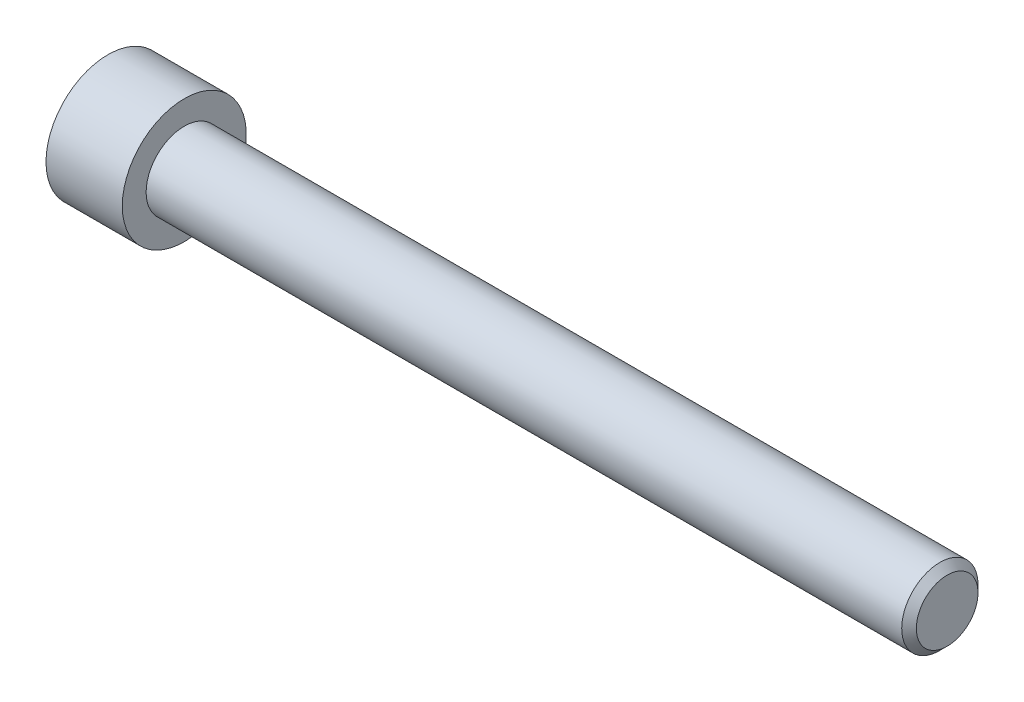
ISO-10303-21;
HEADER;
FILE_DESCRIPTION(('STEP AP214'),'2;1');
FILE_NAME('part.step','',(''),(''),'','','');
FILE_SCHEMA(('AUTOMOTIVE_DESIGN { 1 0 10303 214 1 1 1 1 }'));
ENDSEC;
DATA;
#1=APPLICATION_CONTEXT('core data for automotive mechanical design processes');
#2=APPLICATION_PROTOCOL_DEFINITION('international standard','automotive_design',2000,#1);
#3=PRODUCT_CONTEXT('',#1,'mechanical');
#4=PRODUCT('Part','Part','',(#3));
#5=PRODUCT_RELATED_PRODUCT_CATEGORY('part','',(#4));
#6=PRODUCT_DEFINITION_FORMATION('','',#4);
#7=PRODUCT_DEFINITION_CONTEXT('part definition',#1,'design');
#8=PRODUCT_DEFINITION('design','',#6,#7);
#9=PRODUCT_DEFINITION_SHAPE('','',#8);
#10=(LENGTH_UNIT() NAMED_UNIT(*) SI_UNIT(.MILLI.,.METRE.));
#11=(NAMED_UNIT(*) PLANE_ANGLE_UNIT() SI_UNIT($,.RADIAN.));
#12=(NAMED_UNIT(*) SI_UNIT($,.STERADIAN.) SOLID_ANGLE_UNIT());
#13=UNCERTAINTY_MEASURE_WITH_UNIT(LENGTH_MEASURE(1.E-05),#10,'distance_accuracy_value','');
#14=(GEOMETRIC_REPRESENTATION_CONTEXT(3) GLOBAL_UNCERTAINTY_ASSIGNED_CONTEXT((#13)) GLOBAL_UNIT_ASSIGNED_CONTEXT((#10,
#11,#12)) REPRESENTATION_CONTEXT('',''));
#15=CARTESIAN_POINT('',(0.,0.,0.));
#16=DIRECTION('',(0.,0.,1.));
#17=DIRECTION('',(1.,0.,0.));
#18=AXIS2_PLACEMENT_3D('',#15,#16,#17);
#19=CARTESIAN_POINT('',(-4.0000000000191,0.,0.));
#20=DIRECTION('',(-1.,0.,0.));
#21=DIRECTION('',(0.,0.,1.));
#22=AXIS2_PLACEMENT_3D('',#19,#20,#21);
#23=CONICAL_SURFACE('',#22,2.99000000001115,1.04719755118497);
#24=CARTESIAN_POINT('',(-4.0000000000191,0.,0.));
#25=DIRECTION('',(-1.,0.,0.));
#26=DIRECTION('',(0.,0.,1.));
#27=AXIS2_PLACEMENT_3D('',#24,#25,#26);
#28=CIRCLE('',#27,2.99000000001115);
#29=CARTESIAN_POINT('',(-4.0000000000191,0.,2.99000000001115));
#30=VERTEX_POINT('',#29);
#31=EDGE_CURVE('E19',#30,#30,#28,.T.);
#32=ORIENTED_EDGE('',*,*,#31,.T.);
#33=EDGE_LOOP('',(#32));
#34=FACE_BOUND('',#33,.T.);
#35=CARTESIAN_POINT('',(-2.27372269515058,-5.6843418860808E-11,0.));
#36=VERTEX_POINT('',#35);
#37=VERTEX_LOOP('',#36);
#38=FACE_BOUND('',#37,.T.);
#39=ADVANCED_FACE('F16',(#34,#38),#23,.F.);
#40=CARTESIAN_POINT('',(-4.,0.,0.));
#41=DIRECTION('',(1.,0.,0.));
#42=DIRECTION('',(0.,0.,-1.));
#43=AXIS2_PLACEMENT_3D('',#40,#41,#42);
#44=PLANE('',#43);
#45=ORIENTED_EDGE('',*,*,#31,.F.);
#46=EDGE_LOOP('',(#45));
#47=FACE_BOUND('',#46,.T.);
#48=DIRECTION('',(0.,0.5,0.866025403784439));
#49=VECTOR('',#48,1.);
#50=CARTESIAN_POINT('',(-4.,3.46410161513775,0.));
#51=LINE('',#50,#49);
#52=CARTESIAN_POINT('',(-4.,3.46410161513775,0.));
#53=VERTEX_POINT('',#52);
#54=CARTESIAN_POINT('',(-4.,1.73205080756888,-3.));
#55=VERTEX_POINT('',#54);
#56=EDGE_CURVE('E157',#53,#55,#51,.F.);
#57=ORIENTED_EDGE('',*,*,#56,.T.);
#58=DIRECTION('',(0.,1.,0.));
#59=VECTOR('',#58,1.);
#60=CARTESIAN_POINT('',(-4.,1.73205080756888,-3.));
#61=LINE('',#60,#59);
#62=CARTESIAN_POINT('',(-4.,-1.73205080756888,-3.));
#63=VERTEX_POINT('',#62);
#64=EDGE_CURVE('E170',#55,#63,#61,.F.);
#65=ORIENTED_EDGE('',*,*,#64,.T.);
#66=DIRECTION('',(0.,0.5,-0.866025403784439));
#67=VECTOR('',#66,1.);
#68=CARTESIAN_POINT('',(-4.,-1.73205080756888,-3.));
#69=LINE('',#68,#67);
#70=CARTESIAN_POINT('',(-4.,-3.46410161513775,0.));
#71=VERTEX_POINT('',#70);
#72=EDGE_CURVE('E177',#63,#71,#69,.F.);
#73=ORIENTED_EDGE('',*,*,#72,.T.);
#74=DIRECTION('',(0.,-0.5,-0.866025403784439));
#75=VECTOR('',#74,1.);
#76=CARTESIAN_POINT('',(-4.,-3.46410161513775,0.));
#77=LINE('',#76,#75);
#78=CARTESIAN_POINT('',(-4.,-1.73205080756888,3.));
#79=VERTEX_POINT('',#78);
#80=EDGE_CURVE('E184',#71,#79,#77,.F.);
#81=ORIENTED_EDGE('',*,*,#80,.T.);
#82=DIRECTION('',(0.,1.,0.));
#83=VECTOR('',#82,1.);
#84=CARTESIAN_POINT('',(-4.,-1.73205080756888,3.));
#85=LINE('',#84,#83);
#86=CARTESIAN_POINT('',(-4.,1.73205080756888,3.));
#87=VERTEX_POINT('',#86);
#88=EDGE_CURVE('E141',#79,#87,#85,.T.);
#89=ORIENTED_EDGE('',*,*,#88,.T.);
#90=DIRECTION('',(0.,-0.5,0.866025403784439));
#91=VECTOR('',#90,1.);
#92=CARTESIAN_POINT('',(-4.,1.73205080756888,3.));
#93=LINE('',#92,#91);
#94=EDGE_CURVE('E69',#87,#53,#93,.F.);
#95=ORIENTED_EDGE('',*,*,#94,.T.);
#96=EDGE_LOOP('',(#57,#65,#73,#81,#89,#95));
#97=FACE_BOUND('',#96,.T.);
#98=ADVANCED_FACE('F74',(#47,#97),#44,.F.);
#99=CARTESIAN_POINT('',(-8.,1.73205080756888,3.));
#100=DIRECTION('',(0.,0.866025403784439,0.5));
#101=DIRECTION('',(0.,-0.5,0.866025403784439));
#102=AXIS2_PLACEMENT_3D('',#99,#100,#101);
#103=PLANE('',#102);
#104=DIRECTION('',(1.,0.,0.));
#105=VECTOR('',#104,1.);
#106=CARTESIAN_POINT('',(-8.,1.73205080756888,3.));
#107=LINE('',#106,#105);
#108=CARTESIAN_POINT('',(-8.,1.73205080756888,3.));
#109=VERTEX_POINT('',#108);
#110=EDGE_CURVE('E135',#87,#109,#107,.F.);
#111=ORIENTED_EDGE('',*,*,#110,.T.);
#112=DIRECTION('',(0.,-0.499999999999998,0.86602540378444));
#113=VECTOR('',#112,1.);
#114=CARTESIAN_POINT('',(-8.,3.46410161513775,0.));
#115=LINE('',#114,#113);
#116=CARTESIAN_POINT('',(-8.,3.46410161513775,0.));
#117=VERTEX_POINT('',#116);
#118=EDGE_CURVE('E138',#117,#109,#115,.T.);
#119=ORIENTED_EDGE('',*,*,#118,.F.);
#120=DIRECTION('',(1.,0.,0.));
#121=VECTOR('',#120,1.);
#122=CARTESIAN_POINT('',(-8.,3.46410161513775,0.));
#123=LINE('',#122,#121);
#124=EDGE_CURVE('E162',#117,#53,#123,.T.);
#125=ORIENTED_EDGE('',*,*,#124,.T.);
#126=ORIENTED_EDGE('',*,*,#94,.F.);
#127=EDGE_LOOP('',(#111,#119,#125,#126));
#128=FACE_BOUND('',#127,.T.);
#129=ADVANCED_FACE('F80',(#128),#103,.F.);
#130=CARTESIAN_POINT('',(-8.,-1.73205080756888,3.));
#131=DIRECTION('',(0.,0.,1.));
#132=DIRECTION('',(1.,0.,0.));
#133=AXIS2_PLACEMENT_3D('',#130,#131,#132);
#134=PLANE('',#133);
#135=DIRECTION('',(1.,0.,0.));
#136=VECTOR('',#135,1.);
#137=CARTESIAN_POINT('',(-8.,-1.73205080756887,3.));
#138=LINE('',#137,#136);
#139=CARTESIAN_POINT('',(-8.,-1.73205080756888,3.));
#140=VERTEX_POINT('',#139);
#141=EDGE_CURVE('E146',#79,#140,#138,.F.);
#142=ORIENTED_EDGE('',*,*,#141,.T.);
#143=DIRECTION('',(0.,1.,0.));
#144=VECTOR('',#143,1.);
#145=CARTESIAN_POINT('',(-8.,3.25,3.));
#146=LINE('',#145,#144);
#147=EDGE_CURVE('E144',#109,#140,#146,.F.);
#148=ORIENTED_EDGE('',*,*,#147,.F.);
#149=ORIENTED_EDGE('',*,*,#110,.F.);
#150=ORIENTED_EDGE('',*,*,#88,.F.);
#151=EDGE_LOOP('',(#142,#148,#149,#150));
#152=FACE_BOUND('',#151,.T.);
#153=ADVANCED_FACE('F126',(#152),#134,.F.);
#154=CARTESIAN_POINT('',(-8.,-3.46410161513775,0.));
#155=DIRECTION('',(0.,-0.866025403784439,0.5));
#156=DIRECTION('',(0.,-0.5,-0.866025403784439));
#157=AXIS2_PLACEMENT_3D('',#154,#155,#156);
#158=PLANE('',#157);
#159=DIRECTION('',(1.,0.,0.));
#160=VECTOR('',#159,1.);
#161=CARTESIAN_POINT('',(-8.,-3.46410161513776,0.));
#162=LINE('',#161,#160);
#163=CARTESIAN_POINT('',(-8.,-3.46410161513775,0.));
#164=VERTEX_POINT('',#163);
#165=EDGE_CURVE('E181',#71,#164,#162,.F.);
#166=ORIENTED_EDGE('',*,*,#165,.T.);
#167=DIRECTION('',(0.,-0.499999999999998,-0.86602540378444));
#168=VECTOR('',#167,1.);
#169=CARTESIAN_POINT('',(-8.,-1.73205080756888,3.));
#170=LINE('',#169,#168);
#171=EDGE_CURVE('E150',#140,#164,#170,.T.);
#172=ORIENTED_EDGE('',*,*,#171,.F.);
#173=ORIENTED_EDGE('',*,*,#141,.F.);
#174=ORIENTED_EDGE('',*,*,#80,.F.);
#175=EDGE_LOOP('',(#166,#172,#173,#174));
#176=FACE_BOUND('',#175,.T.);
#177=ADVANCED_FACE('F122',(#176),#158,.F.);
#178=CARTESIAN_POINT('',(-8.,-1.73205080756888,-3.));
#179=DIRECTION('',(0.,-0.866025403784439,-0.5));
#180=DIRECTION('',(0.,0.5,-0.866025403784439));
#181=AXIS2_PLACEMENT_3D('',#178,#179,#180);
#182=PLANE('',#181);
#183=DIRECTION('',(-1.,0.,0.));
#184=VECTOR('',#183,1.);
#185=CARTESIAN_POINT('',(-8.,-1.73205080756888,-3.));
#186=LINE('',#185,#184);
#187=CARTESIAN_POINT('',(-8.,-1.73205080756888,-3.));
#188=VERTEX_POINT('',#187);
#189=EDGE_CURVE('E174',#63,#188,#186,.T.);
#190=ORIENTED_EDGE('',*,*,#189,.T.);
#191=DIRECTION('',(0.,0.499999999999998,-0.86602540378444));
#192=VECTOR('',#191,1.);
#193=CARTESIAN_POINT('',(-8.,-3.46410161513775,0.));
#194=LINE('',#193,#192);
#195=EDGE_CURVE('E212',#164,#188,#194,.T.);
#196=ORIENTED_EDGE('',*,*,#195,.F.);
#197=ORIENTED_EDGE('',*,*,#165,.F.);
#198=ORIENTED_EDGE('',*,*,#72,.F.);
#199=EDGE_LOOP('',(#190,#196,#197,#198));
#200=FACE_BOUND('',#199,.T.);
#201=ADVANCED_FACE('F119',(#200),#182,.F.);
#202=CARTESIAN_POINT('',(-8.,1.73205080756888,-3.));
#203=DIRECTION('',(0.,0.,-1.));
#204=DIRECTION('',(-1.,0.,0.));
#205=AXIS2_PLACEMENT_3D('',#202,#203,#204);
#206=PLANE('',#205);
#207=DIRECTION('',(1.,0.,0.));
#208=VECTOR('',#207,1.);
#209=CARTESIAN_POINT('',(-8.,1.73205080756887,-3.));
#210=LINE('',#209,#208);
#211=CARTESIAN_POINT('',(-8.,1.73205080756888,-3.));
#212=VERTEX_POINT('',#211);
#213=EDGE_CURVE('E35',#55,#212,#210,.F.);
#214=ORIENTED_EDGE('',*,*,#213,.T.);
#215=DIRECTION('',(0.,1.,0.));
#216=VECTOR('',#215,1.);
#217=CARTESIAN_POINT('',(-8.,3.25,-3.));
#218=LINE('',#217,#216);
#219=EDGE_CURVE('E209',#188,#212,#218,.T.);
#220=ORIENTED_EDGE('',*,*,#219,.F.);
#221=ORIENTED_EDGE('',*,*,#189,.F.);
#222=ORIENTED_EDGE('',*,*,#64,.F.);
#223=EDGE_LOOP('',(#214,#220,#221,#222));
#224=FACE_BOUND('',#223,.T.);
#225=ADVANCED_FACE('F115',(#224),#206,.F.);
#226=CARTESIAN_POINT('',(-8.,3.46410161513775,0.));
#227=DIRECTION('',(0.,0.866025403784439,-0.5));
#228=DIRECTION('',(0.,0.5,0.866025403784439));
#229=AXIS2_PLACEMENT_3D('',#226,#227,#228);
#230=PLANE('',#229);
#231=ORIENTED_EDGE('',*,*,#124,.F.);
#232=DIRECTION('',(0.,0.499999999999998,0.86602540378444));
#233=VECTOR('',#232,1.);
#234=CARTESIAN_POINT('',(-8.,1.73205080756888,-3.));
#235=LINE('',#234,#233);
#236=EDGE_CURVE('E155',#212,#117,#235,.T.);
#237=ORIENTED_EDGE('',*,*,#236,.F.);
#238=ORIENTED_EDGE('',*,*,#213,.F.);
#239=ORIENTED_EDGE('',*,*,#56,.F.);
#240=EDGE_LOOP('',(#231,#237,#238,#239));
#241=FACE_BOUND('',#240,.T.);
#242=ADVANCED_FACE('F111',(#241),#230,.F.);
#243=CARTESIAN_POINT('',(-8.,3.25,0.));
#244=DIRECTION('',(-1.,0.,0.));
#245=DIRECTION('',(0.,0.,1.));
#246=AXIS2_PLACEMENT_3D('',#243,#244,#245);
#247=PLANE('',#246);
#248=ORIENTED_EDGE('',*,*,#219,.T.);
#249=ORIENTED_EDGE('',*,*,#236,.T.);
#250=ORIENTED_EDGE('',*,*,#118,.T.);
#251=ORIENTED_EDGE('',*,*,#147,.T.);
#252=ORIENTED_EDGE('',*,*,#171,.T.);
#253=ORIENTED_EDGE('',*,*,#195,.T.);
#254=EDGE_LOOP('',(#248,#249,#250,#251,#252,#253));
#255=FACE_BOUND('',#254,.T.);
#256=CARTESIAN_POINT('',(-8.,0.,0.));
#257=DIRECTION('',(-1.,0.,0.));
#258=DIRECTION('',(0.,0.,1.));
#259=AXIS2_PLACEMENT_3D('',#256,#257,#258);
#260=CIRCLE('',#259,6.5);
#261=CARTESIAN_POINT('',(-8.,0.,6.5));
#262=VERTEX_POINT('',#261);
#263=EDGE_CURVE('E203',#262,#262,#260,.F.);
#264=ORIENTED_EDGE('',*,*,#263,.F.);
#265=EDGE_LOOP('',(#264));
#266=FACE_BOUND('',#265,.T.);
#267=ADVANCED_FACE('F107',(#255,#266),#247,.T.);
#268=CARTESIAN_POINT('',(-4.,0.,0.));
#269=DIRECTION('',(-1.,0.,0.));
#270=DIRECTION('',(0.,0.,1.));
#271=AXIS2_PLACEMENT_3D('',#268,#269,#270);
#272=CYLINDRICAL_SURFACE('',#271,6.5);
#273=CARTESIAN_POINT('',(0.,0.,0.));
#274=DIRECTION('',(-1.,0.,0.));
#275=DIRECTION('',(0.,0.,1.));
#276=AXIS2_PLACEMENT_3D('',#273,#274,#275);
#277=CIRCLE('',#276,6.5);
#278=CARTESIAN_POINT('',(0.,0.,6.5));
#279=VERTEX_POINT('',#278);
#280=EDGE_CURVE('E200',#279,#279,#277,.F.);
#281=ORIENTED_EDGE('',*,*,#280,.F.);
#282=EDGE_LOOP('',(#281));
#283=FACE_BOUND('',#282,.T.);
#284=ORIENTED_EDGE('',*,*,#263,.T.);
#285=EDGE_LOOP('',(#284));
#286=FACE_BOUND('',#285,.T.);
#287=ADVANCED_FACE('F103',(#283,#286),#272,.T.);
#288=CARTESIAN_POINT('',(80.,1.6165,0.));
#289=DIRECTION('',(1.,0.,0.));
#290=DIRECTION('',(0.,0.,-1.));
#291=AXIS2_PLACEMENT_3D('',#288,#289,#290);
#292=PLANE('',#291);
#293=CARTESIAN_POINT('',(79.9999999999841,0.,0.));
#294=DIRECTION('',(-1.,0.,0.));
#295=DIRECTION('',(0.,0.,1.));
#296=AXIS2_PLACEMENT_3D('',#293,#294,#295);
#297=CIRCLE('',#296,3.23300000002291);
#298=CARTESIAN_POINT('',(79.9999999999841,0.,3.23300000002291));
#299=VERTEX_POINT('',#298);
#300=EDGE_CURVE('E196',#299,#299,#297,.T.);
#301=ORIENTED_EDGE('',*,*,#300,.F.);
#302=EDGE_LOOP('',(#301));
#303=FACE_BOUND('',#302,.T.);
#304=ADVANCED_FACE('F99',(#303),#292,.T.);
#305=CARTESIAN_POINT('',(0.,5.25,0.));
#306=DIRECTION('',(1.,0.,0.));
#307=DIRECTION('',(0.,0.,-1.));
#308=AXIS2_PLACEMENT_3D('',#305,#306,#307);
#309=PLANE('',#308);
#310=CARTESIAN_POINT('',(0.,0.,0.));
#311=DIRECTION('',(-1.,0.,0.));
#312=DIRECTION('',(0.,0.,1.));
#313=AXIS2_PLACEMENT_3D('',#310,#311,#312);
#314=CIRCLE('',#313,4.);
#315=CARTESIAN_POINT('',(0.,0.,4.));
#316=VERTEX_POINT('',#315);
#317=EDGE_CURVE('E26',#316,#316,#314,.F.);
#318=ORIENTED_EDGE('',*,*,#317,.F.);
#319=EDGE_LOOP('',(#318));
#320=FACE_BOUND('',#319,.T.);
#321=ORIENTED_EDGE('',*,*,#280,.T.);
#322=EDGE_LOOP('',(#321));
#323=FACE_BOUND('',#322,.T.);
#324=ADVANCED_FACE('F91',(#320,#323),#309,.T.);
#325=CARTESIAN_POINT('',(79.2330000001016,0.,0.));
#326=DIRECTION('',(-1.,0.,0.));
#327=DIRECTION('',(0.,0.,1.));
#328=AXIS2_PLACEMENT_3D('',#325,#326,#327);
#329=CONICAL_SURFACE('',#328,3.99999999996226,0.785398163434504);
#330=ORIENTED_EDGE('',*,*,#300,.T.);
#331=EDGE_LOOP('',(#330));
#332=FACE_BOUND('',#331,.T.);
#333=CARTESIAN_POINT('',(79.233,0.,0.));
#334=DIRECTION('',(-1.,0.,0.));
#335=DIRECTION('',(0.,0.,1.));
#336=AXIS2_PLACEMENT_3D('',#333,#334,#335);
#337=CIRCLE('',#336,4.);
#338=CARTESIAN_POINT('',(79.233,0.,4.));
#339=VERTEX_POINT('',#338);
#340=EDGE_CURVE('E11',#339,#339,#337,.T.);
#341=ORIENTED_EDGE('',*,*,#340,.F.);
#342=EDGE_LOOP('',(#341));
#343=FACE_BOUND('',#342,.T.);
#344=ADVANCED_FACE('F85',(#332,#343),#329,.T.);
#345=CARTESIAN_POINT('',(39.6165,0.,0.));
#346=DIRECTION('',(-1.,0.,0.));
#347=DIRECTION('',(0.,0.,1.));
#348=AXIS2_PLACEMENT_3D('',#345,#346,#347);
#349=CYLINDRICAL_SURFACE('',#348,4.);
#350=ORIENTED_EDGE('',*,*,#317,.T.);
#351=EDGE_LOOP('',(#350));
#352=FACE_BOUND('',#351,.T.);
#353=ORIENTED_EDGE('',*,*,#340,.T.);
#354=EDGE_LOOP('',(#353));
#355=FACE_BOUND('',#354,.T.);
#356=ADVANCED_FACE('F83',(#352,#355),#349,.T.);
#357=CLOSED_SHELL('',(#39,#98,#129,#153,#177,#201,#225,#242,#267,#287,#304,#324,#344,#356));
#358=MANIFOLD_SOLID_BREP('B1',#357);
#359=ADVANCED_BREP_SHAPE_REPRESENTATION('',(#18,#358),#14);
#360=SHAPE_DEFINITION_REPRESENTATION(#9,#359);
ENDSEC;
END-ISO-10303-21;
